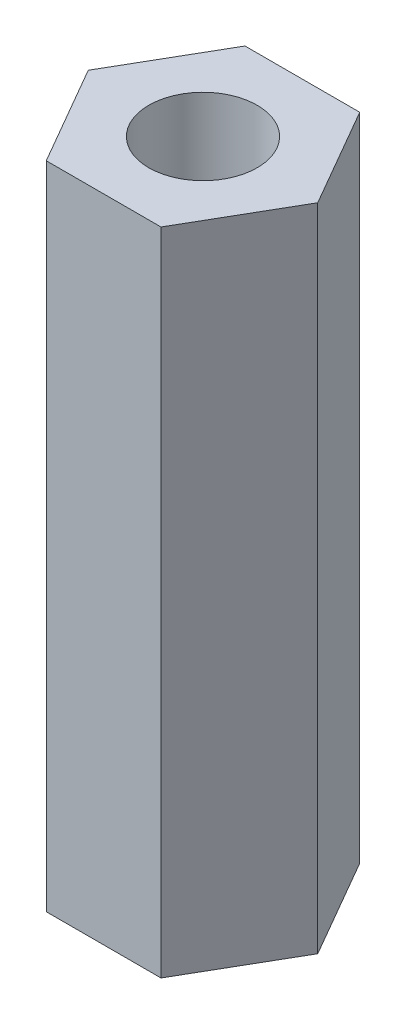
ISO-10303-21;
HEADER;
FILE_DESCRIPTION(('STEP AP214'),'2;1');
FILE_NAME('part.step','',(''),(''),'','','');
FILE_SCHEMA(('AUTOMOTIVE_DESIGN { 1 0 10303 214 1 1 1 1 }'));
ENDSEC;
DATA;
#1=APPLICATION_CONTEXT('core data for automotive mechanical design processes');
#2=APPLICATION_PROTOCOL_DEFINITION('international standard','automotive_design',2000,#1);
#3=PRODUCT_CONTEXT('',#1,'mechanical');
#4=PRODUCT('Part','Part','',(#3));
#5=PRODUCT_RELATED_PRODUCT_CATEGORY('part','',(#4));
#6=PRODUCT_DEFINITION_FORMATION('','',#4);
#7=PRODUCT_DEFINITION_CONTEXT('part definition',#1,'design');
#8=PRODUCT_DEFINITION('design','',#6,#7);
#9=PRODUCT_DEFINITION_SHAPE('','',#8);
#10=(LENGTH_UNIT() NAMED_UNIT(*) SI_UNIT(.MILLI.,.METRE.));
#11=(NAMED_UNIT(*) PLANE_ANGLE_UNIT() SI_UNIT($,.RADIAN.));
#12=(NAMED_UNIT(*) SI_UNIT($,.STERADIAN.) SOLID_ANGLE_UNIT());
#13=UNCERTAINTY_MEASURE_WITH_UNIT(LENGTH_MEASURE(1.E-05),#10,'distance_accuracy_value','');
#14=(GEOMETRIC_REPRESENTATION_CONTEXT(3) GLOBAL_UNCERTAINTY_ASSIGNED_CONTEXT((#13)) GLOBAL_UNIT_ASSIGNED_CONTEXT((#10,
#11,#12)) REPRESENTATION_CONTEXT('',''));
#15=CARTESIAN_POINT('',(0.,0.,0.));
#16=DIRECTION('',(0.,0.,1.));
#17=DIRECTION('',(1.,0.,0.));
#18=AXIS2_PLACEMENT_3D('',#15,#16,#17);
#19=CARTESIAN_POINT('',(0.,18.,0.));
#20=DIRECTION('',(0.,1.,0.));
#21=DIRECTION('',(0.,0.,1.));
#22=AXIS2_PLACEMENT_3D('',#19,#20,#21);
#23=PLANE('',#22);
#24=DIRECTION('',(0.499999999999995,0.,-0.866025403784441));
#25=VECTOR('',#24,1.);
#26=CARTESIAN_POINT('',(1.5877132402715,18.,2.74999999999997));
#27=LINE('',#26,#25);
#28=CARTESIAN_POINT('',(1.5877132402715,18.,2.74999999999997));
#29=VERTEX_POINT('',#28);
#30=CARTESIAN_POINT('',(3.17542648054293,18.,0.));
#31=VERTEX_POINT('',#30);
#32=EDGE_CURVE('E146',#29,#31,#27,.T.);
#33=ORIENTED_EDGE('',*,*,#32,.T.);
#34=DIRECTION('',(-0.500000000000001,0.,-0.866025403784438));
#35=VECTOR('',#34,1.);
#36=CARTESIAN_POINT('',(3.17542648054293,18.,0.));
#37=LINE('',#36,#35);
#38=CARTESIAN_POINT('',(1.58771324027146,18.,-2.74999999999999));
#39=VERTEX_POINT('',#38);
#40=EDGE_CURVE('E94',#31,#39,#37,.T.);
#41=ORIENTED_EDGE('',*,*,#40,.T.);
#42=DIRECTION('',(-1.,0.,0.));
#43=VECTOR('',#42,1.);
#44=CARTESIAN_POINT('',(1.58771324027146,18.,-2.74999999999999));
#45=LINE('',#44,#43);
#46=CARTESIAN_POINT('',(-1.58771324027148,18.,-2.74999999999998));
#47=VERTEX_POINT('',#46);
#48=EDGE_CURVE('E107',#39,#47,#45,.T.);
#49=ORIENTED_EDGE('',*,*,#48,.T.);
#50=DIRECTION('',(-0.499999999999995,0.,0.866025403784442));
#51=VECTOR('',#50,1.);
#52=CARTESIAN_POINT('',(-1.58771324027148,18.,-2.74999999999998));
#53=LINE('',#52,#51);
#54=CARTESIAN_POINT('',(-3.17542648054293,18.,0.));
#55=VERTEX_POINT('',#54);
#56=EDGE_CURVE('E101',#47,#55,#53,.T.);
#57=ORIENTED_EDGE('',*,*,#56,.T.);
#58=DIRECTION('',(0.500000000000007,0.,0.866025403784435));
#59=VECTOR('',#58,1.);
#60=CARTESIAN_POINT('',(-3.17542648054293,18.,0.));
#61=LINE('',#60,#59);
#62=CARTESIAN_POINT('',(-1.58771324027144,18.,2.75));
#63=VERTEX_POINT('',#62);
#64=EDGE_CURVE('E105',#55,#63,#61,.T.);
#65=ORIENTED_EDGE('',*,*,#64,.T.);
#66=DIRECTION('',(1.,0.,0.));
#67=VECTOR('',#66,1.);
#68=CARTESIAN_POINT('',(-1.58771324027144,18.,2.75));
#69=LINE('',#68,#67);
#70=EDGE_CURVE('E57',#63,#29,#69,.T.);
#71=ORIENTED_EDGE('',*,*,#70,.T.);
#72=EDGE_LOOP('',(#33,#41,#49,#57,#65,#71));
#73=FACE_BOUND('',#72,.T.);
#74=CARTESIAN_POINT('',(0.,18.,0.));
#75=DIRECTION('',(0.,1.,0.));
#76=DIRECTION('',(0.,0.,1.));
#77=AXIS2_PLACEMENT_3D('',#74,#75,#76);
#78=CIRCLE('',#77,1.5);
#79=CARTESIAN_POINT('',(0.,18.,1.5));
#80=VERTEX_POINT('',#79);
#81=EDGE_CURVE('E134',#80,#80,#78,.T.);
#82=ORIENTED_EDGE('',*,*,#81,.F.);
#83=EDGE_LOOP('',(#82));
#84=FACE_BOUND('',#83,.T.);
#85=ADVANCED_FACE('F39',(#73,#84),#23,.T.);
#86=CARTESIAN_POINT('',(0.,0.,0.));
#87=DIRECTION('',(0.,1.,0.));
#88=DIRECTION('',(0.,0.,1.));
#89=AXIS2_PLACEMENT_3D('',#86,#87,#88);
#90=PLANE('',#89);
#91=DIRECTION('',(0.499999999999995,0.,-0.866025403784441));
#92=VECTOR('',#91,1.);
#93=CARTESIAN_POINT('',(1.5877132402715,0.,2.74999999999997));
#94=LINE('',#93,#92);
#95=CARTESIAN_POINT('',(1.5877132402715,0.,2.74999999999997));
#96=VERTEX_POINT('',#95);
#97=CARTESIAN_POINT('',(3.17542648054293,0.,0.));
#98=VERTEX_POINT('',#97);
#99=EDGE_CURVE('E129',#96,#98,#94,.T.);
#100=ORIENTED_EDGE('',*,*,#99,.F.);
#101=DIRECTION('',(1.,0.,0.));
#102=VECTOR('',#101,1.);
#103=CARTESIAN_POINT('',(-1.58771324027144,0.,2.75));
#104=LINE('',#103,#102);
#105=CARTESIAN_POINT('',(-1.58771324027144,0.,2.75));
#106=VERTEX_POINT('',#105);
#107=EDGE_CURVE('E86',#106,#96,#104,.T.);
#108=ORIENTED_EDGE('',*,*,#107,.F.);
#109=DIRECTION('',(0.500000000000007,0.,0.866025403784435));
#110=VECTOR('',#109,1.);
#111=CARTESIAN_POINT('',(-3.17542648054293,0.,0.));
#112=LINE('',#111,#110);
#113=CARTESIAN_POINT('',(-3.17542648054293,0.,0.));
#114=VERTEX_POINT('',#113);
#115=EDGE_CURVE('E80',#114,#106,#112,.T.);
#116=ORIENTED_EDGE('',*,*,#115,.F.);
#117=DIRECTION('',(-0.499999999999995,0.,0.866025403784442));
#118=VECTOR('',#117,1.);
#119=CARTESIAN_POINT('',(-1.58771324027148,0.,-2.74999999999998));
#120=LINE('',#119,#118);
#121=CARTESIAN_POINT('',(-1.58771324027148,0.,-2.74999999999998));
#122=VERTEX_POINT('',#121);
#123=EDGE_CURVE('E116',#122,#114,#120,.T.);
#124=ORIENTED_EDGE('',*,*,#123,.F.);
#125=DIRECTION('',(-1.,0.,0.));
#126=VECTOR('',#125,1.);
#127=CARTESIAN_POINT('',(1.58771324027146,0.,-2.74999999999999));
#128=LINE('',#127,#126);
#129=CARTESIAN_POINT('',(1.58771324027146,0.,-2.74999999999999));
#130=VERTEX_POINT('',#129);
#131=EDGE_CURVE('E137',#130,#122,#128,.T.);
#132=ORIENTED_EDGE('',*,*,#131,.F.);
#133=DIRECTION('',(-0.500000000000001,0.,-0.866025403784438));
#134=VECTOR('',#133,1.);
#135=CARTESIAN_POINT('',(3.17542648054293,0.,0.));
#136=LINE('',#135,#134);
#137=EDGE_CURVE('E133',#98,#130,#136,.T.);
#138=ORIENTED_EDGE('',*,*,#137,.F.);
#139=EDGE_LOOP('',(#100,#108,#116,#124,#132,#138));
#140=FACE_BOUND('',#139,.T.);
#141=CARTESIAN_POINT('',(0.,0.,0.));
#142=DIRECTION('',(0.,1.,0.));
#143=DIRECTION('',(0.,0.,1.));
#144=AXIS2_PLACEMENT_3D('',#141,#142,#143);
#145=CIRCLE('',#144,1.5);
#146=CARTESIAN_POINT('',(0.,0.,1.5));
#147=VERTEX_POINT('',#146);
#148=EDGE_CURVE('E243',#147,#147,#145,.T.);
#149=ORIENTED_EDGE('',*,*,#148,.T.);
#150=EDGE_LOOP('',(#149));
#151=FACE_BOUND('',#150,.T.);
#152=ADVANCED_FACE('F159',(#140,#151),#90,.F.);
#153=CARTESIAN_POINT('',(1.5877132402715,18.,2.74999999999997));
#154=DIRECTION('',(-0.866025403784441,0.,-0.499999999999995));
#155=DIRECTION('',(-0.499999999999995,0.,0.866025403784441));
#156=AXIS2_PLACEMENT_3D('',#153,#154,#155);
#157=PLANE('',#156);
#158=ORIENTED_EDGE('',*,*,#99,.T.);
#159=DIRECTION('',(0.,-1.,0.));
#160=VECTOR('',#159,1.);
#161=CARTESIAN_POINT('',(3.17542648054293,18.,0.));
#162=LINE('',#161,#160);
#163=EDGE_CURVE('E11',#31,#98,#162,.T.);
#164=ORIENTED_EDGE('',*,*,#163,.F.);
#165=ORIENTED_EDGE('',*,*,#32,.F.);
#166=DIRECTION('',(0.,-1.,0.));
#167=VECTOR('',#166,1.);
#168=CARTESIAN_POINT('',(1.5877132402715,18.,2.74999999999997));
#169=LINE('',#168,#167);
#170=EDGE_CURVE('E125',#29,#96,#169,.T.);
#171=ORIENTED_EDGE('',*,*,#170,.T.);
#172=EDGE_LOOP('',(#158,#164,#165,#171));
#173=FACE_BOUND('',#172,.T.);
#174=ADVANCED_FACE('F41',(#173),#157,.F.);
#175=CARTESIAN_POINT('',(3.17542648054293,18.,0.));
#176=DIRECTION('',(-0.866025403784438,0.,0.500000000000001));
#177=DIRECTION('',(0.500000000000001,0.,0.866025403784438));
#178=AXIS2_PLACEMENT_3D('',#175,#176,#177);
#179=PLANE('',#178);
#180=ORIENTED_EDGE('',*,*,#137,.T.);
#181=DIRECTION('',(0.,-1.,0.));
#182=VECTOR('',#181,1.);
#183=CARTESIAN_POINT('',(1.58771324027146,18.,-2.74999999999999));
#184=LINE('',#183,#182);
#185=EDGE_CURVE('E49',#39,#130,#184,.T.);
#186=ORIENTED_EDGE('',*,*,#185,.F.);
#187=ORIENTED_EDGE('',*,*,#40,.F.);
#188=ORIENTED_EDGE('',*,*,#163,.T.);
#189=EDGE_LOOP('',(#180,#186,#187,#188));
#190=FACE_BOUND('',#189,.T.);
#191=ADVANCED_FACE('F184',(#190),#179,.F.);
#192=CARTESIAN_POINT('',(1.58771324027146,18.,-2.74999999999999));
#193=DIRECTION('',(0.,0.,1.));
#194=DIRECTION('',(1.,0.,0.));
#195=AXIS2_PLACEMENT_3D('',#192,#193,#194);
#196=PLANE('',#195);
#197=ORIENTED_EDGE('',*,*,#131,.T.);
#198=DIRECTION('',(0.,-1.,0.));
#199=VECTOR('',#198,1.);
#200=CARTESIAN_POINT('',(-1.58771324027148,18.,-2.74999999999998));
#201=LINE('',#200,#199);
#202=EDGE_CURVE('E118',#47,#122,#201,.T.);
#203=ORIENTED_EDGE('',*,*,#202,.F.);
#204=ORIENTED_EDGE('',*,*,#48,.F.);
#205=ORIENTED_EDGE('',*,*,#185,.T.);
#206=EDGE_LOOP('',(#197,#203,#204,#205));
#207=FACE_BOUND('',#206,.T.);
#208=ADVANCED_FACE('F156',(#207),#196,.F.);
#209=CARTESIAN_POINT('',(-1.58771324027148,18.,-2.74999999999998));
#210=DIRECTION('',(0.866025403784442,0.,0.499999999999995));
#211=DIRECTION('',(0.499999999999995,0.,-0.866025403784442));
#212=AXIS2_PLACEMENT_3D('',#209,#210,#211);
#213=PLANE('',#212);
#214=ORIENTED_EDGE('',*,*,#123,.T.);
#215=DIRECTION('',(0.,-1.,0.));
#216=VECTOR('',#215,1.);
#217=CARTESIAN_POINT('',(-3.17542648054293,18.,0.));
#218=LINE('',#217,#216);
#219=EDGE_CURVE('E113',#55,#114,#218,.T.);
#220=ORIENTED_EDGE('',*,*,#219,.F.);
#221=ORIENTED_EDGE('',*,*,#56,.F.);
#222=ORIENTED_EDGE('',*,*,#202,.T.);
#223=EDGE_LOOP('',(#214,#220,#221,#222));
#224=FACE_BOUND('',#223,.T.);
#225=ADVANCED_FACE('F114',(#224),#213,.F.);
#226=CARTESIAN_POINT('',(-3.17542648054293,18.,0.));
#227=DIRECTION('',(0.866025403784435,0.,-0.500000000000007));
#228=DIRECTION('',(-0.500000000000007,0.,-0.866025403784435));
#229=AXIS2_PLACEMENT_3D('',#226,#227,#228);
#230=PLANE('',#229);
#231=ORIENTED_EDGE('',*,*,#115,.T.);
#232=DIRECTION('',(0.,-1.,0.));
#233=VECTOR('',#232,1.);
#234=CARTESIAN_POINT('',(-1.58771324027144,18.,2.75));
#235=LINE('',#234,#233);
#236=EDGE_CURVE('E119',#63,#106,#235,.T.);
#237=ORIENTED_EDGE('',*,*,#236,.F.);
#238=ORIENTED_EDGE('',*,*,#64,.F.);
#239=ORIENTED_EDGE('',*,*,#219,.T.);
#240=EDGE_LOOP('',(#231,#237,#238,#239));
#241=FACE_BOUND('',#240,.T.);
#242=ADVANCED_FACE('F121',(#241),#230,.F.);
#243=CARTESIAN_POINT('',(-1.58771324027144,18.,2.75));
#244=DIRECTION('',(0.,0.,-1.));
#245=DIRECTION('',(-1.,0.,0.));
#246=AXIS2_PLACEMENT_3D('',#243,#244,#245);
#247=PLANE('',#246);
#248=ORIENTED_EDGE('',*,*,#107,.T.);
#249=ORIENTED_EDGE('',*,*,#170,.F.);
#250=ORIENTED_EDGE('',*,*,#70,.F.);
#251=ORIENTED_EDGE('',*,*,#236,.T.);
#252=EDGE_LOOP('',(#248,#249,#250,#251));
#253=FACE_BOUND('',#252,.T.);
#254=ADVANCED_FACE('F164',(#253),#247,.F.);
#255=CARTESIAN_POINT('',(0.,18.,0.));
#256=DIRECTION('',(0.,-1.,0.));
#257=DIRECTION('',(0.,0.,-1.));
#258=AXIS2_PLACEMENT_3D('',#255,#256,#257);
#259=CYLINDRICAL_SURFACE('',#258,1.5);
#260=ORIENTED_EDGE('',*,*,#81,.T.);
#261=EDGE_LOOP('',(#260));
#262=FACE_BOUND('',#261,.T.);
#263=ORIENTED_EDGE('',*,*,#148,.F.);
#264=EDGE_LOOP('',(#263));
#265=FACE_BOUND('',#264,.T.);
#266=ADVANCED_FACE('F166',(#262,#265),#259,.F.);
#267=CLOSED_SHELL('',(#85,#152,#174,#191,#208,#225,#242,#254,#266));
#268=MANIFOLD_SOLID_BREP('B2',#267);
#269=ADVANCED_BREP_SHAPE_REPRESENTATION('',(#18,#268),#14);
#270=SHAPE_DEFINITION_REPRESENTATION(#9,#269);
ENDSEC;
END-ISO-10303-21;
